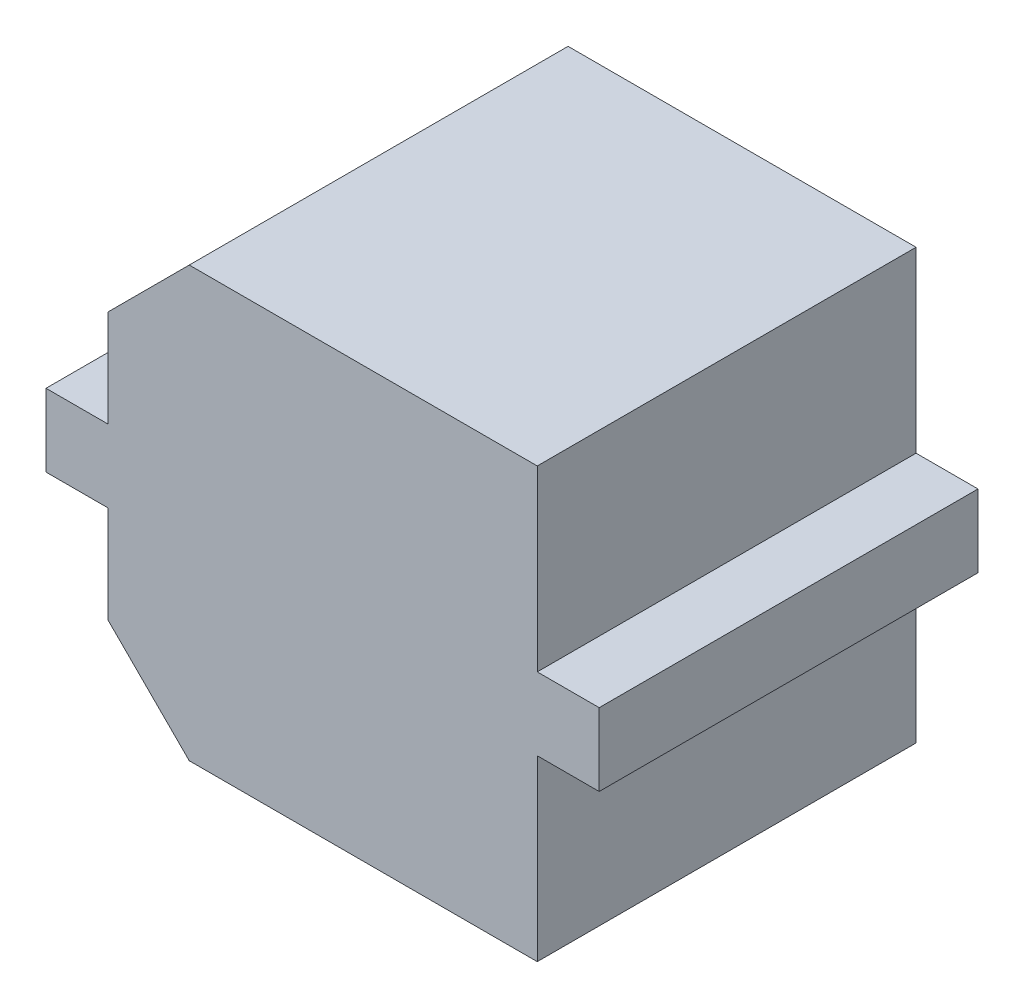
ISO-10303-21;
HEADER;
FILE_DESCRIPTION(('STEP AP214'),'2;1');
FILE_NAME('part.step','',(''),(''),'','','');
FILE_SCHEMA(('AUTOMOTIVE_DESIGN { 1 0 10303 214 1 1 1 1 }'));
ENDSEC;
DATA;
#1=APPLICATION_CONTEXT('core data for automotive mechanical design processes');
#2=APPLICATION_PROTOCOL_DEFINITION('international standard','automotive_design',2000,#1);
#3=PRODUCT_CONTEXT('',#1,'mechanical');
#4=PRODUCT('Part','Part','',(#3));
#5=PRODUCT_RELATED_PRODUCT_CATEGORY('part','',(#4));
#6=PRODUCT_DEFINITION_FORMATION('','',#4);
#7=PRODUCT_DEFINITION_CONTEXT('part definition',#1,'design');
#8=PRODUCT_DEFINITION('design','',#6,#7);
#9=PRODUCT_DEFINITION_SHAPE('','',#8);
#10=(LENGTH_UNIT() NAMED_UNIT(*) SI_UNIT(.MILLI.,.METRE.));
#11=(NAMED_UNIT(*) PLANE_ANGLE_UNIT() SI_UNIT($,.RADIAN.));
#12=(NAMED_UNIT(*) SI_UNIT($,.STERADIAN.) SOLID_ANGLE_UNIT());
#13=UNCERTAINTY_MEASURE_WITH_UNIT(LENGTH_MEASURE(1.E-05),#10,'distance_accuracy_value','');
#14=(GEOMETRIC_REPRESENTATION_CONTEXT(3) GLOBAL_UNCERTAINTY_ASSIGNED_CONTEXT((#13)) GLOBAL_UNIT_ASSIGNED_CONTEXT((#10,
#11,#12)) REPRESENTATION_CONTEXT('',''));
#15=CARTESIAN_POINT('',(0.,0.,0.));
#16=DIRECTION('',(0.,0.,1.));
#17=DIRECTION('',(1.,0.,0.));
#18=AXIS2_PLACEMENT_3D('',#15,#16,#17);
#19=CARTESIAN_POINT('',(-4.381,0.575,0.));
#20=DIRECTION('',(-1.,0.,0.));
#21=DIRECTION('',(0.,0.,1.));
#22=AXIS2_PLACEMENT_3D('',#19,#20,#21);
#23=PLANE('',#22);
#24=DIRECTION('',(0.,0.,1.));
#25=VECTOR('',#24,1.);
#26=CARTESIAN_POINT('',(-4.381,0.575,0.));
#27=LINE('',#26,#25);
#28=CARTESIAN_POINT('',(-4.381,0.575,0.));
#29=VERTEX_POINT('',#28);
#30=CARTESIAN_POINT('',(-4.381,0.575,6.));
#31=VERTEX_POINT('',#30);
#32=EDGE_CURVE('E122',#29,#31,#27,.T.);
#33=ORIENTED_EDGE('',*,*,#32,.F.);
#34=DIRECTION('',(0.,1.,0.));
#35=VECTOR('',#34,1.);
#36=CARTESIAN_POINT('',(-4.381,0.575,0.));
#37=LINE('',#36,#35);
#38=CARTESIAN_POINT('',(-4.381,-0.575,0.));
#39=VERTEX_POINT('',#38);
#40=EDGE_CURVE('E114',#29,#39,#37,.F.);
#41=ORIENTED_EDGE('',*,*,#40,.T.);
#42=DIRECTION('',(0.,0.,-1.));
#43=VECTOR('',#42,1.);
#44=CARTESIAN_POINT('',(-4.381,-0.575,0.));
#45=LINE('',#44,#43);
#46=CARTESIAN_POINT('',(-4.381,-0.575,6.));
#47=VERTEX_POINT('',#46);
#48=EDGE_CURVE('E124',#47,#39,#45,.T.);
#49=ORIENTED_EDGE('',*,*,#48,.F.);
#50=DIRECTION('',(0.,1.,0.));
#51=VECTOR('',#50,1.);
#52=CARTESIAN_POINT('',(-4.381,0.575,6.));
#53=LINE('',#52,#51);
#54=EDGE_CURVE('E19',#47,#31,#53,.T.);
#55=ORIENTED_EDGE('',*,*,#54,.T.);
#56=EDGE_LOOP('',(#33,#41,#49,#55));
#57=FACE_BOUND('',#56,.T.);
#58=ADVANCED_FACE('F16',(#57),#23,.T.);
#59=CARTESIAN_POINT('',(4.381,-0.575,0.));
#60=DIRECTION('',(1.,0.,0.));
#61=DIRECTION('',(0.,0.,-1.));
#62=AXIS2_PLACEMENT_3D('',#59,#60,#61);
#63=PLANE('',#62);
#64=DIRECTION('',(0.,0.,-1.));
#65=VECTOR('',#64,1.);
#66=CARTESIAN_POINT('',(4.381,-0.575,0.));
#67=LINE('',#66,#65);
#68=CARTESIAN_POINT('',(4.381,-0.575,0.));
#69=VERTEX_POINT('',#68);
#70=CARTESIAN_POINT('',(4.381,-0.575,6.));
#71=VERTEX_POINT('',#70);
#72=EDGE_CURVE('E157',#69,#71,#67,.F.);
#73=ORIENTED_EDGE('',*,*,#72,.F.);
#74=DIRECTION('',(0.,1.,0.));
#75=VECTOR('',#74,1.);
#76=CARTESIAN_POINT('',(4.381,-0.575,0.));
#77=LINE('',#76,#75);
#78=CARTESIAN_POINT('',(4.381,0.575,0.));
#79=VERTEX_POINT('',#78);
#80=EDGE_CURVE('E135',#69,#79,#77,.T.);
#81=ORIENTED_EDGE('',*,*,#80,.T.);
#82=DIRECTION('',(0.,0.,1.));
#83=VECTOR('',#82,1.);
#84=CARTESIAN_POINT('',(4.381,0.575,0.));
#85=LINE('',#84,#83);
#86=CARTESIAN_POINT('',(4.381,0.575,6.));
#87=VERTEX_POINT('',#86);
#88=EDGE_CURVE('E170',#87,#79,#85,.F.);
#89=ORIENTED_EDGE('',*,*,#88,.F.);
#90=DIRECTION('',(0.,1.,0.));
#91=VECTOR('',#90,1.);
#92=CARTESIAN_POINT('',(4.381,-0.575,6.));
#93=LINE('',#92,#91);
#94=EDGE_CURVE('E148',#87,#71,#93,.F.);
#95=ORIENTED_EDGE('',*,*,#94,.T.);
#96=EDGE_LOOP('',(#73,#81,#89,#95));
#97=FACE_BOUND('',#96,.T.);
#98=ADVANCED_FACE('F251',(#97),#63,.T.);
#99=CARTESIAN_POINT('',(-3.4,0.575,0.));
#100=DIRECTION('',(0.,1.,0.));
#101=DIRECTION('',(0.,0.,1.));
#102=AXIS2_PLACEMENT_3D('',#99,#100,#101);
#103=PLANE('',#102);
#104=DIRECTION('',(0.,0.,1.));
#105=VECTOR('',#104,1.);
#106=CARTESIAN_POINT('',(-3.4,0.575,0.));
#107=LINE('',#106,#105);
#108=CARTESIAN_POINT('',(-3.4,0.575,0.));
#109=VERTEX_POINT('',#108);
#110=CARTESIAN_POINT('',(-3.4,0.575,6.));
#111=VERTEX_POINT('',#110);
#112=EDGE_CURVE('E176',#109,#111,#107,.T.);
#113=ORIENTED_EDGE('',*,*,#112,.F.);
#114=DIRECTION('',(1.,0.,0.));
#115=VECTOR('',#114,1.);
#116=CARTESIAN_POINT('',(-3.4,0.575,0.));
#117=LINE('',#116,#115);
#118=EDGE_CURVE('E134',#109,#29,#117,.F.);
#119=ORIENTED_EDGE('',*,*,#118,.T.);
#120=ORIENTED_EDGE('',*,*,#32,.T.);
#121=DIRECTION('',(1.,0.,0.));
#122=VECTOR('',#121,1.);
#123=CARTESIAN_POINT('',(-3.4,0.575,6.));
#124=LINE('',#123,#122);
#125=EDGE_CURVE('E132',#31,#111,#124,.T.);
#126=ORIENTED_EDGE('',*,*,#125,.T.);
#127=EDGE_LOOP('',(#113,#119,#120,#126));
#128=FACE_BOUND('',#127,.T.);
#129=ADVANCED_FACE('F131',(#128),#103,.T.);
#130=CARTESIAN_POINT('',(-4.381,-0.575,0.));
#131=DIRECTION('',(0.,-1.,0.));
#132=DIRECTION('',(0.,0.,-1.));
#133=AXIS2_PLACEMENT_3D('',#130,#131,#132);
#134=PLANE('',#133);
#135=ORIENTED_EDGE('',*,*,#48,.T.);
#136=DIRECTION('',(1.,0.,0.));
#137=VECTOR('',#136,1.);
#138=CARTESIAN_POINT('',(-4.381,-0.575,0.));
#139=LINE('',#138,#137);
#140=CARTESIAN_POINT('',(-3.4,-0.575,0.));
#141=VERTEX_POINT('',#140);
#142=EDGE_CURVE('E153',#39,#141,#139,.T.);
#143=ORIENTED_EDGE('',*,*,#142,.T.);
#144=DIRECTION('',(0.,0.,1.));
#145=VECTOR('',#144,1.);
#146=CARTESIAN_POINT('',(-3.4,-0.575,0.));
#147=LINE('',#146,#145);
#148=CARTESIAN_POINT('',(-3.4,-0.575,6.));
#149=VERTEX_POINT('',#148);
#150=EDGE_CURVE('E178',#149,#141,#147,.F.);
#151=ORIENTED_EDGE('',*,*,#150,.F.);
#152=DIRECTION('',(1.,0.,0.));
#153=VECTOR('',#152,1.);
#154=CARTESIAN_POINT('',(-4.381,-0.575,6.));
#155=LINE('',#154,#153);
#156=EDGE_CURVE('E143',#149,#47,#155,.F.);
#157=ORIENTED_EDGE('',*,*,#156,.T.);
#158=EDGE_LOOP('',(#135,#143,#151,#157));
#159=FACE_BOUND('',#158,.T.);
#160=ADVANCED_FACE('F151',(#159),#134,.T.);
#161=CARTESIAN_POINT('',(3.4,-0.575,0.));
#162=DIRECTION('',(0.,-1.,0.));
#163=DIRECTION('',(0.,0.,-1.));
#164=AXIS2_PLACEMENT_3D('',#161,#162,#163);
#165=PLANE('',#164);
#166=DIRECTION('',(0.,0.,-1.));
#167=VECTOR('',#166,1.);
#168=CARTESIAN_POINT('',(3.4,-0.575,0.));
#169=LINE('',#168,#167);
#170=CARTESIAN_POINT('',(3.4,-0.575,0.));
#171=VERTEX_POINT('',#170);
#172=CARTESIAN_POINT('',(3.4,-0.575,6.));
#173=VERTEX_POINT('',#172);
#174=EDGE_CURVE('E180',#171,#173,#169,.F.);
#175=ORIENTED_EDGE('',*,*,#174,.F.);
#176=DIRECTION('',(1.,0.,0.));
#177=VECTOR('',#176,1.);
#178=CARTESIAN_POINT('',(3.4,-0.575,0.));
#179=LINE('',#178,#177);
#180=EDGE_CURVE('E165',#171,#69,#179,.T.);
#181=ORIENTED_EDGE('',*,*,#180,.T.);
#182=ORIENTED_EDGE('',*,*,#72,.T.);
#183=DIRECTION('',(1.,0.,0.));
#184=VECTOR('',#183,1.);
#185=CARTESIAN_POINT('',(3.4,-0.575,6.));
#186=LINE('',#185,#184);
#187=EDGE_CURVE('E160',#71,#173,#186,.F.);
#188=ORIENTED_EDGE('',*,*,#187,.T.);
#189=EDGE_LOOP('',(#175,#181,#182,#188));
#190=FACE_BOUND('',#189,.T.);
#191=ADVANCED_FACE('F256',(#190),#165,.T.);
#192=CARTESIAN_POINT('',(4.381,0.575,0.));
#193=DIRECTION('',(0.,1.,0.));
#194=DIRECTION('',(0.,0.,1.));
#195=AXIS2_PLACEMENT_3D('',#192,#193,#194);
#196=PLANE('',#195);
#197=ORIENTED_EDGE('',*,*,#88,.T.);
#198=DIRECTION('',(1.,0.,0.));
#199=VECTOR('',#198,1.);
#200=CARTESIAN_POINT('',(4.381,0.575,0.));
#201=LINE('',#200,#199);
#202=CARTESIAN_POINT('',(3.4,0.575,0.));
#203=VERTEX_POINT('',#202);
#204=EDGE_CURVE('E173',#79,#203,#201,.F.);
#205=ORIENTED_EDGE('',*,*,#204,.T.);
#206=DIRECTION('',(0.,0.,-1.));
#207=VECTOR('',#206,1.);
#208=CARTESIAN_POINT('',(3.4,0.575,0.));
#209=LINE('',#208,#207);
#210=CARTESIAN_POINT('',(3.4,0.575,6.));
#211=VERTEX_POINT('',#210);
#212=EDGE_CURVE('E183',#211,#203,#209,.T.);
#213=ORIENTED_EDGE('',*,*,#212,.F.);
#214=DIRECTION('',(1.,0.,0.));
#215=VECTOR('',#214,1.);
#216=CARTESIAN_POINT('',(4.381,0.575,6.));
#217=LINE('',#216,#215);
#218=EDGE_CURVE('E168',#211,#87,#217,.T.);
#219=ORIENTED_EDGE('',*,*,#218,.T.);
#220=EDGE_LOOP('',(#197,#205,#213,#219));
#221=FACE_BOUND('',#220,.T.);
#222=ADVANCED_FACE('F246',(#221),#196,.T.);
#223=CARTESIAN_POINT('',(-3.4,2.112,0.));
#224=DIRECTION('',(-1.,0.,0.));
#225=DIRECTION('',(0.,0.,1.));
#226=AXIS2_PLACEMENT_3D('',#223,#224,#225);
#227=PLANE('',#226);
#228=DIRECTION('',(0.,0.,1.));
#229=VECTOR('',#228,1.);
#230=CARTESIAN_POINT('',(-3.4,2.112,0.));
#231=LINE('',#230,#229);
#232=CARTESIAN_POINT('',(-3.4,2.112,0.));
#233=VERTEX_POINT('',#232);
#234=CARTESIAN_POINT('',(-3.4,2.112,6.));
#235=VERTEX_POINT('',#234);
#236=EDGE_CURVE('E204',#233,#235,#231,.T.);
#237=ORIENTED_EDGE('',*,*,#236,.F.);
#238=DIRECTION('',(0.,1.,0.));
#239=VECTOR('',#238,1.);
#240=CARTESIAN_POINT('',(-3.4,2.112,0.));
#241=LINE('',#240,#239);
#242=EDGE_CURVE('E186',#233,#109,#241,.F.);
#243=ORIENTED_EDGE('',*,*,#242,.T.);
#244=ORIENTED_EDGE('',*,*,#112,.T.);
#245=DIRECTION('',(0.,1.,0.));
#246=VECTOR('',#245,1.);
#247=CARTESIAN_POINT('',(-3.4,0.,6.));
#248=LINE('',#247,#246);
#249=EDGE_CURVE('E141',#235,#111,#248,.F.);
#250=ORIENTED_EDGE('',*,*,#249,.F.);
#251=EDGE_LOOP('',(#237,#243,#244,#250));
#252=FACE_BOUND('',#251,.T.);
#253=ADVANCED_FACE('F277',(#252),#227,.T.);
#254=CARTESIAN_POINT('',(0.,0.,6.));
#255=DIRECTION('',(0.,0.,1.));
#256=DIRECTION('',(1.,0.,0.));
#257=AXIS2_PLACEMENT_3D('',#254,#255,#256);
#258=PLANE('',#257);
#259=DIRECTION('',(0.707106781186548,-0.707106781186548,0.));
#260=VECTOR('',#259,1.);
#261=CARTESIAN_POINT('',(-3.4,-2.112,6.));
#262=LINE('',#261,#260);
#263=CARTESIAN_POINT('',(-2.112,-3.4,6.));
#264=VERTEX_POINT('',#263);
#265=CARTESIAN_POINT('',(-3.4,-2.112,6.));
#266=VERTEX_POINT('',#265);
#267=EDGE_CURVE('E213',#264,#266,#262,.F.);
#268=ORIENTED_EDGE('',*,*,#267,.F.);
#269=DIRECTION('',(1.,0.,0.));
#270=VECTOR('',#269,1.);
#271=CARTESIAN_POINT('',(-2.112,-3.4,6.));
#272=LINE('',#271,#270);
#273=CARTESIAN_POINT('',(3.4,-3.4,6.));
#274=VERTEX_POINT('',#273);
#275=EDGE_CURVE('E192',#274,#264,#272,.F.);
#276=ORIENTED_EDGE('',*,*,#275,.F.);
#277=DIRECTION('',(0.,1.,0.));
#278=VECTOR('',#277,1.);
#279=CARTESIAN_POINT('',(3.4,-3.4,6.));
#280=LINE('',#279,#278);
#281=EDGE_CURVE('E194',#173,#274,#280,.F.);
#282=ORIENTED_EDGE('',*,*,#281,.F.);
#283=ORIENTED_EDGE('',*,*,#187,.F.);
#284=ORIENTED_EDGE('',*,*,#94,.F.);
#285=ORIENTED_EDGE('',*,*,#218,.F.);
#286=DIRECTION('',(0.,1.,0.));
#287=VECTOR('',#286,1.);
#288=CARTESIAN_POINT('',(3.4,0.825,6.));
#289=LINE('',#288,#287);
#290=CARTESIAN_POINT('',(3.4,3.4,6.));
#291=VERTEX_POINT('',#290);
#292=EDGE_CURVE('E198',#291,#211,#289,.F.);
#293=ORIENTED_EDGE('',*,*,#292,.F.);
#294=DIRECTION('',(1.,0.,0.));
#295=VECTOR('',#294,1.);
#296=CARTESIAN_POINT('',(3.4,3.4,6.));
#297=LINE('',#296,#295);
#298=CARTESIAN_POINT('',(-2.112,3.4,6.));
#299=VERTEX_POINT('',#298);
#300=EDGE_CURVE('E200',#299,#291,#297,.T.);
#301=ORIENTED_EDGE('',*,*,#300,.F.);
#302=DIRECTION('',(-0.707106781186548,-0.707106781186548,0.));
#303=VECTOR('',#302,1.);
#304=CARTESIAN_POINT('',(-2.112,3.4,6.));
#305=LINE('',#304,#303);
#306=EDGE_CURVE('E206',#235,#299,#305,.F.);
#307=ORIENTED_EDGE('',*,*,#306,.F.);
#308=ORIENTED_EDGE('',*,*,#249,.T.);
#309=ORIENTED_EDGE('',*,*,#125,.F.);
#310=ORIENTED_EDGE('',*,*,#54,.F.);
#311=ORIENTED_EDGE('',*,*,#156,.F.);
#312=DIRECTION('',(0.,1.,0.));
#313=VECTOR('',#312,1.);
#314=CARTESIAN_POINT('',(-3.4,-0.826,6.));
#315=LINE('',#314,#313);
#316=EDGE_CURVE('E189',#266,#149,#315,.T.);
#317=ORIENTED_EDGE('',*,*,#316,.F.);
#318=EDGE_LOOP('',(#268,#276,#282,#283,#284,#285,#293,#301,#307,#308,#309,#310,#311,#317));
#319=FACE_BOUND('',#318,.T.);
#320=ADVANCED_FACE('F138',(#319),#258,.T.);
#321=CARTESIAN_POINT('',(-3.4,-0.826,0.));
#322=DIRECTION('',(-1.,0.,0.));
#323=DIRECTION('',(0.,0.,1.));
#324=AXIS2_PLACEMENT_3D('',#321,#322,#323);
#325=PLANE('',#324);
#326=ORIENTED_EDGE('',*,*,#316,.T.);
#327=ORIENTED_EDGE('',*,*,#150,.T.);
#328=DIRECTION('',(0.,1.,0.));
#329=VECTOR('',#328,1.);
#330=CARTESIAN_POINT('',(-3.4,-0.826,0.));
#331=LINE('',#330,#329);
#332=CARTESIAN_POINT('',(-3.4,-2.112,0.));
#333=VERTEX_POINT('',#332);
#334=EDGE_CURVE('E34',#141,#333,#331,.F.);
#335=ORIENTED_EDGE('',*,*,#334,.T.);
#336=DIRECTION('',(0.,0.,1.));
#337=VECTOR('',#336,1.);
#338=CARTESIAN_POINT('',(-3.4,-2.112,0.));
#339=LINE('',#338,#337);
#340=EDGE_CURVE('E215',#266,#333,#339,.F.);
#341=ORIENTED_EDGE('',*,*,#340,.F.);
#342=EDGE_LOOP('',(#326,#327,#335,#341));
#343=FACE_BOUND('',#342,.T.);
#344=ADVANCED_FACE('F268',(#343),#325,.T.);
#345=CARTESIAN_POINT('',(-2.112,-3.4,0.));
#346=DIRECTION('',(0.,-1.,0.));
#347=DIRECTION('',(0.,0.,-1.));
#348=AXIS2_PLACEMENT_3D('',#345,#346,#347);
#349=PLANE('',#348);
#350=DIRECTION('',(0.,0.,1.));
#351=VECTOR('',#350,1.);
#352=CARTESIAN_POINT('',(-2.112,-3.4,0.));
#353=LINE('',#352,#351);
#354=CARTESIAN_POINT('',(-2.112,-3.4,0.));
#355=VERTEX_POINT('',#354);
#356=EDGE_CURVE('E210',#355,#264,#353,.T.);
#357=ORIENTED_EDGE('',*,*,#356,.F.);
#358=DIRECTION('',(1.,0.,0.));
#359=VECTOR('',#358,1.);
#360=CARTESIAN_POINT('',(0.,-3.4,0.));
#361=LINE('',#360,#359);
#362=CARTESIAN_POINT('',(3.4,-3.4,0.));
#363=VERTEX_POINT('',#362);
#364=EDGE_CURVE('E217',#355,#363,#361,.T.);
#365=ORIENTED_EDGE('',*,*,#364,.T.);
#366=DIRECTION('',(0.,0.,-1.));
#367=VECTOR('',#366,1.);
#368=CARTESIAN_POINT('',(3.4,-3.4,0.));
#369=LINE('',#368,#367);
#370=EDGE_CURVE('E196',#274,#363,#369,.T.);
#371=ORIENTED_EDGE('',*,*,#370,.F.);
#372=ORIENTED_EDGE('',*,*,#275,.T.);
#373=EDGE_LOOP('',(#357,#365,#371,#372));
#374=FACE_BOUND('',#373,.T.);
#375=ADVANCED_FACE('F264',(#374),#349,.T.);
#376=CARTESIAN_POINT('',(3.4,-3.4,0.));
#377=DIRECTION('',(1.,0.,0.));
#378=DIRECTION('',(0.,0.,-1.));
#379=AXIS2_PLACEMENT_3D('',#376,#377,#378);
#380=PLANE('',#379);
#381=ORIENTED_EDGE('',*,*,#370,.T.);
#382=DIRECTION('',(0.,1.,0.));
#383=VECTOR('',#382,1.);
#384=CARTESIAN_POINT('',(3.4,0.,0.));
#385=LINE('',#384,#383);
#386=EDGE_CURVE('E220',#363,#171,#385,.T.);
#387=ORIENTED_EDGE('',*,*,#386,.T.);
#388=ORIENTED_EDGE('',*,*,#174,.T.);
#389=ORIENTED_EDGE('',*,*,#281,.T.);
#390=EDGE_LOOP('',(#381,#387,#388,#389));
#391=FACE_BOUND('',#390,.T.);
#392=ADVANCED_FACE('F259',(#391),#380,.T.);
#393=CARTESIAN_POINT('',(3.4,0.825,0.));
#394=DIRECTION('',(1.,0.,0.));
#395=DIRECTION('',(0.,0.,-1.));
#396=AXIS2_PLACEMENT_3D('',#393,#394,#395);
#397=PLANE('',#396);
#398=ORIENTED_EDGE('',*,*,#292,.T.);
#399=ORIENTED_EDGE('',*,*,#212,.T.);
#400=DIRECTION('',(0.,1.,0.));
#401=VECTOR('',#400,1.);
#402=CARTESIAN_POINT('',(3.4,0.,0.));
#403=LINE('',#402,#401);
#404=CARTESIAN_POINT('',(3.4,3.4,0.));
#405=VERTEX_POINT('',#404);
#406=EDGE_CURVE('E222',#203,#405,#403,.T.);
#407=ORIENTED_EDGE('',*,*,#406,.T.);
#408=DIRECTION('',(0.,0.,1.));
#409=VECTOR('',#408,1.);
#410=CARTESIAN_POINT('',(3.4,3.4,0.));
#411=LINE('',#410,#409);
#412=EDGE_CURVE('E202',#291,#405,#411,.F.);
#413=ORIENTED_EDGE('',*,*,#412,.F.);
#414=EDGE_LOOP('',(#398,#399,#407,#413));
#415=FACE_BOUND('',#414,.T.);
#416=ADVANCED_FACE('F241',(#415),#397,.T.);
#417=CARTESIAN_POINT('',(3.4,3.4,0.));
#418=DIRECTION('',(0.,1.,0.));
#419=DIRECTION('',(0.,0.,1.));
#420=AXIS2_PLACEMENT_3D('',#417,#418,#419);
#421=PLANE('',#420);
#422=ORIENTED_EDGE('',*,*,#412,.T.);
#423=DIRECTION('',(1.,0.,0.));
#424=VECTOR('',#423,1.);
#425=CARTESIAN_POINT('',(0.,3.4,0.));
#426=LINE('',#425,#424);
#427=CARTESIAN_POINT('',(-2.112,3.4,0.));
#428=VERTEX_POINT('',#427);
#429=EDGE_CURVE('E225',#405,#428,#426,.F.);
#430=ORIENTED_EDGE('',*,*,#429,.T.);
#431=DIRECTION('',(0.,0.,1.));
#432=VECTOR('',#431,1.);
#433=CARTESIAN_POINT('',(-2.112,3.4,0.));
#434=LINE('',#433,#432);
#435=EDGE_CURVE('E208',#299,#428,#434,.F.);
#436=ORIENTED_EDGE('',*,*,#435,.F.);
#437=ORIENTED_EDGE('',*,*,#300,.T.);
#438=EDGE_LOOP('',(#422,#430,#436,#437));
#439=FACE_BOUND('',#438,.T.);
#440=ADVANCED_FACE('F236',(#439),#421,.T.);
#441=CARTESIAN_POINT('',(-2.112,3.4,0.));
#442=DIRECTION('',(-0.707106781186548,0.707106781186548,0.));
#443=DIRECTION('',(-0.707106781186548,-0.707106781186548,0.));
#444=AXIS2_PLACEMENT_3D('',#441,#442,#443);
#445=PLANE('',#444);
#446=ORIENTED_EDGE('',*,*,#435,.T.);
#447=DIRECTION('',(-0.707106781186548,-0.707106781186548,0.));
#448=VECTOR('',#447,1.);
#449=CARTESIAN_POINT('',(-2.112,3.4,0.));
#450=LINE('',#449,#448);
#451=EDGE_CURVE('E25',#428,#233,#450,.T.);
#452=ORIENTED_EDGE('',*,*,#451,.T.);
#453=ORIENTED_EDGE('',*,*,#236,.T.);
#454=ORIENTED_EDGE('',*,*,#306,.T.);
#455=EDGE_LOOP('',(#446,#452,#453,#454));
#456=FACE_BOUND('',#455,.T.);
#457=ADVANCED_FACE('F231',(#456),#445,.T.);
#458=CARTESIAN_POINT('',(-3.4,-2.112,0.));
#459=DIRECTION('',(-0.707106781186548,-0.707106781186548,0.));
#460=DIRECTION('',(0.707106781186548,-0.707106781186548,0.));
#461=AXIS2_PLACEMENT_3D('',#458,#459,#460);
#462=PLANE('',#461);
#463=ORIENTED_EDGE('',*,*,#340,.T.);
#464=DIRECTION('',(0.707106781186548,-0.707106781186548,0.));
#465=VECTOR('',#464,1.);
#466=CARTESIAN_POINT('',(-3.4,-2.112,0.));
#467=LINE('',#466,#465);
#468=EDGE_CURVE('E11',#333,#355,#467,.T.);
#469=ORIENTED_EDGE('',*,*,#468,.T.);
#470=ORIENTED_EDGE('',*,*,#356,.T.);
#471=ORIENTED_EDGE('',*,*,#267,.T.);
#472=EDGE_LOOP('',(#463,#469,#470,#471));
#473=FACE_BOUND('',#472,.T.);
#474=ADVANCED_FACE('F266',(#473),#462,.T.);
#475=CARTESIAN_POINT('',(0.,0.,0.));
#476=DIRECTION('',(0.,0.,1.));
#477=DIRECTION('',(1.,0.,0.));
#478=AXIS2_PLACEMENT_3D('',#475,#476,#477);
#479=PLANE('',#478);
#480=ORIENTED_EDGE('',*,*,#334,.F.);
#481=ORIENTED_EDGE('',*,*,#142,.F.);
#482=ORIENTED_EDGE('',*,*,#40,.F.);
#483=ORIENTED_EDGE('',*,*,#118,.F.);
#484=ORIENTED_EDGE('',*,*,#242,.F.);
#485=ORIENTED_EDGE('',*,*,#451,.F.);
#486=ORIENTED_EDGE('',*,*,#429,.F.);
#487=ORIENTED_EDGE('',*,*,#406,.F.);
#488=ORIENTED_EDGE('',*,*,#204,.F.);
#489=ORIENTED_EDGE('',*,*,#80,.F.);
#490=ORIENTED_EDGE('',*,*,#180,.F.);
#491=ORIENTED_EDGE('',*,*,#386,.F.);
#492=ORIENTED_EDGE('',*,*,#364,.F.);
#493=ORIENTED_EDGE('',*,*,#468,.F.);
#494=EDGE_LOOP('',(#480,#481,#482,#483,#484,#485,#486,#487,#488,#489,#490,#491,#492,#493));
#495=FACE_BOUND('',#494,.T.);
#496=ADVANCED_FACE('F155',(#495),#479,.F.);
#497=CLOSED_SHELL('',(#58,#98,#129,#160,#191,#222,#253,#320,#344,#375,#392,#416,#440,#457,#474,#496));
#498=MANIFOLD_SOLID_BREP('B1',#497);
#499=ADVANCED_BREP_SHAPE_REPRESENTATION('',(#18,#498),#14);
#500=SHAPE_DEFINITION_REPRESENTATION(#9,#499);
ENDSEC;
END-ISO-10303-21;
